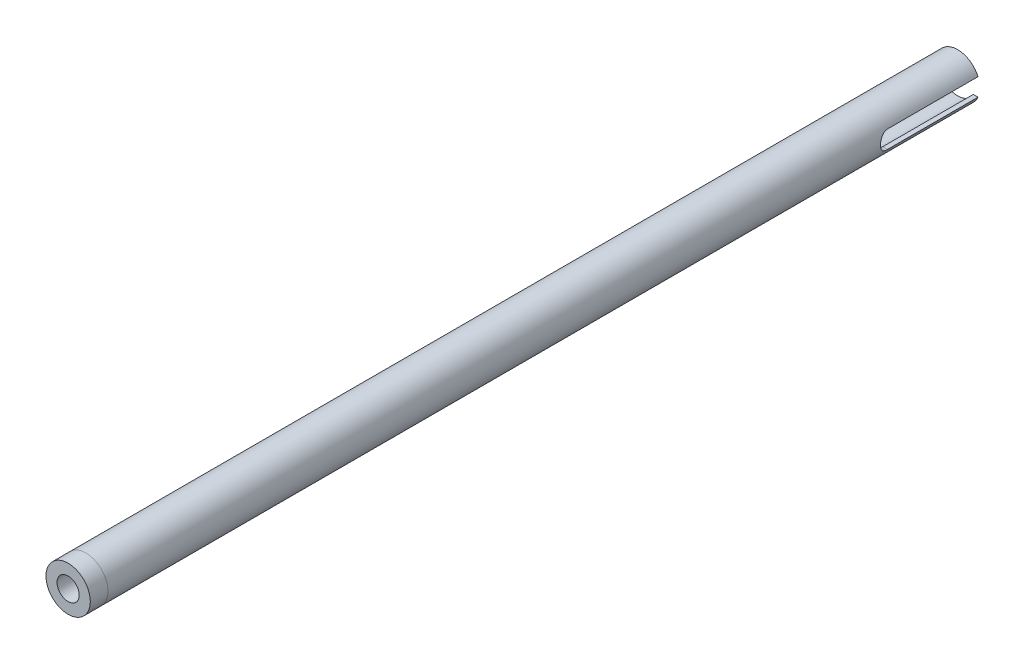
ISO-10303-21;
HEADER;
FILE_DESCRIPTION(('STEP AP214'),'2;1');
FILE_NAME('part.step','',(''),(''),'','','');
FILE_SCHEMA(('AUTOMOTIVE_DESIGN { 1 0 10303 214 1 1 1 1 }'));
ENDSEC;
DATA;
#1=APPLICATION_CONTEXT('core data for automotive mechanical design processes');
#2=APPLICATION_PROTOCOL_DEFINITION('international standard','automotive_design',2000,#1);
#3=PRODUCT_CONTEXT('',#1,'mechanical');
#4=PRODUCT('Part','Part','',(#3));
#5=PRODUCT_RELATED_PRODUCT_CATEGORY('part','',(#4));
#6=PRODUCT_DEFINITION_FORMATION('','',#4);
#7=PRODUCT_DEFINITION_CONTEXT('part definition',#1,'design');
#8=PRODUCT_DEFINITION('design','',#6,#7);
#9=PRODUCT_DEFINITION_SHAPE('','',#8);
#10=(LENGTH_UNIT() NAMED_UNIT(*) SI_UNIT(.MILLI.,.METRE.));
#11=(NAMED_UNIT(*) PLANE_ANGLE_UNIT() SI_UNIT($,.RADIAN.));
#12=(NAMED_UNIT(*) SI_UNIT($,.STERADIAN.) SOLID_ANGLE_UNIT());
#13=UNCERTAINTY_MEASURE_WITH_UNIT(LENGTH_MEASURE(1.E-05),#10,'distance_accuracy_value','');
#14=(GEOMETRIC_REPRESENTATION_CONTEXT(3) GLOBAL_UNCERTAINTY_ASSIGNED_CONTEXT((#13)) GLOBAL_UNIT_ASSIGNED_CONTEXT((#10,
#11,#12)) REPRESENTATION_CONTEXT('',''));
#15=CARTESIAN_POINT('',(0.,0.,0.));
#16=DIRECTION('',(0.,0.,1.));
#17=DIRECTION('',(1.,0.,0.));
#18=AXIS2_PLACEMENT_3D('',#15,#16,#17);
#19=CARTESIAN_POINT('',(0.,0.,-318.482551856964));
#20=DIRECTION('',(0.,0.,1.));
#21=DIRECTION('',(1.,0.,0.));
#22=AXIS2_PLACEMENT_3D('',#19,#20,#21);
#23=CYLINDRICAL_SURFACE('',#22,7.9375);
#24=CARTESIAN_POINT('',(0.,0.,-6.35));
#25=DIRECTION('',(0.,0.,1.));
#26=DIRECTION('',(1.,0.,0.));
#27=AXIS2_PLACEMENT_3D('',#24,#25,#26);
#28=CIRCLE('',#27,7.9375);
#29=CARTESIAN_POINT('',(7.9375,0.,-6.35));
#30=VERTEX_POINT('',#29);
#31=EDGE_CURVE('E165',#30,#30,#28,.T.);
#32=ORIENTED_EDGE('',*,*,#31,.F.);
#33=EDGE_LOOP('',(#32));
#34=FACE_BOUND('',#33,.T.);
#35=CARTESIAN_POINT('',(-7.2748389157424,3.175,-286.097551856964));
#36=CARTESIAN_POINT('',(-7.27482137043434,3.17501267173453,-286.012131741482));
#37=CARTESIAN_POINT('',(-7.27634297592672,3.17155313247793,-285.926721211919));
#38=CARTESIAN_POINT('',(-7.28233338484875,3.15778866907725,-285.756589207591));
#39=CARTESIAN_POINT('',(-7.28680106535325,3.14748635311323,-285.671867482732));
#40=CARTESIAN_POINT('',(-7.2985291631267,3.12019002880163,-285.504053782923));
#41=CARTESIAN_POINT('',(-7.30577831906487,3.10322299732752,-285.420956638164));
#42=CARTESIAN_POINT('',(-7.32282161153744,3.06278779397035,-285.256645536139));
#43=CARTESIAN_POINT('',(-7.33261590324725,3.03931922568674,-285.175431694025));
#44=CARTESIAN_POINT('',(-7.36535331460444,2.95952924342962,-284.935606871443));
#45=CARTESIAN_POINT('',(-7.39167595677839,2.89376893609239,-284.780481942639));
#46=CARTESIAN_POINT('',(-7.45033259991547,2.73920602658923,-284.483394515928));
#47=CARTESIAN_POINT('',(-7.48267254395243,2.65038060922872,-284.34144524071));
#48=CARTESIAN_POINT('',(-7.55175295441387,2.44684429809694,-284.06672447119));
#49=CARTESIAN_POINT('',(-7.58863404630155,2.33103943595687,-283.934797086678));
#50=CARTESIAN_POINT('',(-7.66147718953598,2.07914562663533,-283.691634203046));
#51=CARTESIAN_POINT('',(-7.69743902899202,1.94305205135846,-283.580403438119));
#52=CARTESIAN_POINT('',(-7.76611692840651,1.64778282664419,-283.377482238623));
#53=CARTESIAN_POINT('',(-7.79864638434712,1.48790317306356,-283.286747827219));
#54=CARTESIAN_POINT('',(-7.85502980346525,1.15369615984563,-283.133890273802));
#55=CARTESIAN_POINT('',(-7.87889360585224,0.979385463602722,-283.071734661184));
#56=CARTESIAN_POINT('',(-7.91022225039827,0.670405323433354,-282.991223017529));
#57=CARTESIAN_POINT('',(-7.92038443902171,0.537888188660439,-282.965545094119));
#58=CARTESIAN_POINT('',(-7.93061686811603,0.337231082382107,-282.939790011038));
#59=CARTESIAN_POINT('',(-7.93319257341971,0.269991647180298,-282.933331913757));
#60=CARTESIAN_POINT('',(-7.93663621925193,0.135173873369596,-282.924710896005));
#61=CARTESIAN_POINT('',(-7.93750363389236,0.0675954368175869,-282.922549298187));
#62=CARTESIAN_POINT('',(-7.9375,0.,-282.922551856964));
#63=B_SPLINE_CURVE_WITH_KNOTS('',3,(#35,#36,#37,#38,#39,#40,#41,#42,#43,#44,#45,#46,#47,#48,#49,
#50,#51,#52,#53,#54,#55,#56,#57,#58,#59,#60,#61,#62),.UNSPECIFIED.,.F.,.F.,(4,2,2,2,2,2,2,2,2,2,
2,2,2,4),(0.,0.256160797396612,0.512224013007058,0.767261264672238,1.02231406945471,
1.53142416248594,2.04103978047897,2.57679273649405,3.11266809162683,3.66991136029742,
4.22651992730645,4.63134321412666,4.8339937586662,5.03670667834028),.UNSPECIFIED.);
#64=CARTESIAN_POINT('',(-7.2748389157424,3.175,-286.097551856964));
#65=VERTEX_POINT('',#64);
#66=CARTESIAN_POINT('',(-7.9375,0.,-282.922551856964));
#67=VERTEX_POINT('',#66);
#68=EDGE_CURVE('E192',#65,#67,#63,.T.);
#69=ORIENTED_EDGE('',*,*,#68,.T.);
#70=CARTESIAN_POINT('',(-7.9375,0.,-282.922551856964));
#71=CARTESIAN_POINT('',(-7.93751279435796,-0.08569732438932,-282.922539826795));
#72=CARTESIAN_POINT('',(-7.93611246860092,-0.171386675169294,-282.926021194267));
#73=CARTESIAN_POINT('',(-7.93058107051394,-0.342092796869093,-282.939877289602));
#74=CARTESIAN_POINT('',(-7.92645080745519,-0.427109759557725,-282.950249974585));
#75=CARTESIAN_POINT('',(-7.91557399086504,-0.595570690948326,-282.977747168652));
#76=CARTESIAN_POINT('',(-7.90883664469869,-0.679019123580016,-282.994847919925));
#77=CARTESIAN_POINT('',(-7.89293284658536,-0.844038966454648,-283.035615167399));
#78=CARTESIAN_POINT('',(-7.88376629739099,-0.925610301410305,-283.059281926455));
#79=CARTESIAN_POINT('',(-7.85297007832481,-1.16656173687588,-283.139789582154));
#80=CARTESIAN_POINT('',(-7.82802544143958,-1.32244720282989,-283.206182215031));
#81=CARTESIAN_POINT('',(-7.77174407779742,-1.62081902572888,-283.362227619024));
#82=CARTESIAN_POINT('',(-7.74040257287306,-1.7632952496653,-283.451897791087));
#83=CARTESIAN_POINT('',(-7.67287736621953,-2.03755465224644,-283.656351398603));
#84=CARTESIAN_POINT('',(-7.63654472176442,-2.16862853615059,-283.772038255334));
#85=CARTESIAN_POINT('',(-7.56380976030912,-2.41011022612819,-284.023332357043));
#86=CARTESIAN_POINT('',(-7.52740741976911,-2.52050895891189,-284.158948301525));
#87=CARTESIAN_POINT('',(-7.45683282624284,-2.72240939900242,-284.453646796392));
#88=CARTESIAN_POINT('',(-7.4228346735038,-2.81283701743189,-284.613510786307));
#89=CARTESIAN_POINT('',(-7.3633362219632,-2.96511894168388,-284.947636751104));
#90=CARTESIAN_POINT('',(-7.33782422493328,-3.02701262758154,-285.121878488863));
#91=CARTESIAN_POINT('',(-7.30424985403508,-3.10695047193342,-285.430182213514));
#92=CARTESIAN_POINT('',(-7.29331360019113,-3.13238569878909,-285.5620409744));
#93=CARTESIAN_POINT('',(-7.28227977674291,-3.15790858319001,-285.761757856094));
#94=CARTESIAN_POINT('',(-7.27949685702346,-3.16431127275807,-285.828706146854));
#95=CARTESIAN_POINT('',(-7.27577355567174,-3.17285909036155,-285.96294770472));
#96=CARTESIAN_POINT('',(-7.27483380475762,-3.1750027609968,-286.030241082018));
#97=CARTESIAN_POINT('',(-7.2748389157424,-3.175,-286.097551856964));
#98=B_SPLINE_CURVE_WITH_KNOTS('',3,(#70,#71,#72,#73,#74,#75,#76,#77,#78,#79,#80,#81,#82,#83,#84,
#85,#86,#87,#88,#89,#90,#91,#92,#93,#94,#95,#96,#97),.UNSPECIFIED.,.F.,.F.,(4,2,2,2,2,2,2,2,2,2,
2,2,2,4),(0.,0.256996432008011,0.513916713336987,0.769937797705391,1.02596913282157,
1.53722547809954,2.04886511530059,2.58219314099272,3.11575467201799,3.67332953074261,
4.2301325519037,4.63306130520182,4.8348500382744,5.03670780985613),.UNSPECIFIED.);
#99=CARTESIAN_POINT('',(-7.2748389157424,-3.175,-286.097551856964));
#100=VERTEX_POINT('',#99);
#101=EDGE_CURVE('E144',#67,#100,#98,.T.);
#102=ORIENTED_EDGE('',*,*,#101,.T.);
#103=DIRECTION('',(0.,0.,-1.));
#104=VECTOR('',#103,1.);
#105=CARTESIAN_POINT('',(-7.2748389157424,-3.175,-282.922551856964));
#106=LINE('',#105,#104);
#107=CARTESIAN_POINT('',(-7.2748389157424,-3.175,-318.482551856964));
#108=VERTEX_POINT('',#107);
#109=EDGE_CURVE('E139',#100,#108,#106,.T.);
#110=ORIENTED_EDGE('',*,*,#109,.T.);
#111=CARTESIAN_POINT('',(0.,0.,-318.482551856964));
#112=DIRECTION('',(0.,0.,1.));
#113=DIRECTION('',(1.,0.,0.));
#114=AXIS2_PLACEMENT_3D('',#111,#112,#113);
#115=CIRCLE('',#114,7.9375);
#116=CARTESIAN_POINT('',(7.2748389157424,-3.175,-318.482551856964));
#117=VERTEX_POINT('',#116);
#118=EDGE_CURVE('E142',#108,#117,#115,.T.);
#119=ORIENTED_EDGE('',*,*,#118,.T.);
#120=DIRECTION('',(0.,0.,-1.));
#121=VECTOR('',#120,1.);
#122=CARTESIAN_POINT('',(7.2748389157424,-3.175,-282.922551856964));
#123=LINE('',#122,#121);
#124=CARTESIAN_POINT('',(7.2748389157424,-3.175,-286.097551856964));
#125=VERTEX_POINT('',#124);
#126=EDGE_CURVE('E425',#125,#117,#123,.T.);
#127=ORIENTED_EDGE('',*,*,#126,.F.);
#128=CARTESIAN_POINT('',(7.2748389157424,-3.175,-286.097551856964));
#129=CARTESIAN_POINT('',(7.27482137043434,-3.17501267173453,-286.012131741482));
#130=CARTESIAN_POINT('',(7.27634297592672,-3.17155313247793,-285.926721211919));
#131=CARTESIAN_POINT('',(7.28233338484875,-3.15778866907725,-285.756589207591));
#132=CARTESIAN_POINT('',(7.28680106535325,-3.14748635311323,-285.671867482732));
#133=CARTESIAN_POINT('',(7.2985291631267,-3.12019002880163,-285.504053782923));
#134=CARTESIAN_POINT('',(7.30577831906487,-3.10322299732752,-285.420956638164));
#135=CARTESIAN_POINT('',(7.32282161153744,-3.06278779397035,-285.256645536139));
#136=CARTESIAN_POINT('',(7.33261590324725,-3.03931922568674,-285.175431694025));
#137=CARTESIAN_POINT('',(7.36535331460444,-2.95952924342962,-284.935606871443));
#138=CARTESIAN_POINT('',(7.39167595677839,-2.89376893609239,-284.780481942639));
#139=CARTESIAN_POINT('',(7.45033259991547,-2.73920602658923,-284.483394515928));
#140=CARTESIAN_POINT('',(7.48267254395243,-2.65038060922872,-284.34144524071));
#141=CARTESIAN_POINT('',(7.55175295441387,-2.44684429809694,-284.06672447119));
#142=CARTESIAN_POINT('',(7.58863404630155,-2.33103943595687,-283.934797086678));
#143=CARTESIAN_POINT('',(7.66147718953598,-2.07914562663533,-283.691634203046));
#144=CARTESIAN_POINT('',(7.69743902899202,-1.94305205135846,-283.580403438119));
#145=CARTESIAN_POINT('',(7.76611692840651,-1.64778282664419,-283.377482238623));
#146=CARTESIAN_POINT('',(7.79864638434712,-1.48790317306356,-283.286747827219));
#147=CARTESIAN_POINT('',(7.85502980346525,-1.15369615984563,-283.133890273802));
#148=CARTESIAN_POINT('',(7.87889360585224,-0.979385463602722,-283.071734661184));
#149=CARTESIAN_POINT('',(7.91022225039827,-0.670405323433354,-282.991223017529));
#150=CARTESIAN_POINT('',(7.92038443902171,-0.537888188660439,-282.965545094119));
#151=CARTESIAN_POINT('',(7.93061686811603,-0.337231082382107,-282.939790011038));
#152=CARTESIAN_POINT('',(7.93319257341971,-0.269991647180298,-282.933331913757));
#153=CARTESIAN_POINT('',(7.93663621925193,-0.135173873369596,-282.924710896005));
#154=CARTESIAN_POINT('',(7.93750363389236,-0.0675954368175869,-282.922549298187));
#155=CARTESIAN_POINT('',(7.9375,0.,-282.922551856964));
#156=B_SPLINE_CURVE_WITH_KNOTS('',3,(#128,#129,#130,#131,#132,#133,#134,#135,#136,#137,#138,
#139,#140,#141,#142,#143,#144,#145,#146,#147,#148,#149,#150,#151,#152,#153,#154,#155),
.UNSPECIFIED.,.F.,.F.,(4,2,2,2,2,2,2,2,2,2,2,2,2,4),(0.,0.256160797396612,0.512224013007058,
0.767261264672238,1.02231406945471,1.53142416248594,2.04103978047897,2.57679273649405,
3.11266809162683,3.66991136029742,4.22651992730645,4.63134321412666,4.8339937586662,
5.03670667834028),.UNSPECIFIED.);
#157=CARTESIAN_POINT('',(7.9375,0.,-282.922551856964));
#158=VERTEX_POINT('',#157);
#159=EDGE_CURVE('E85',#125,#158,#156,.T.);
#160=ORIENTED_EDGE('',*,*,#159,.T.);
#161=CARTESIAN_POINT('',(7.9375,0.,-282.922551856964));
#162=CARTESIAN_POINT('',(7.93751279435796,0.08569732438932,-282.922539826795));
#163=CARTESIAN_POINT('',(7.93611246860092,0.171386675169294,-282.926021194267));
#164=CARTESIAN_POINT('',(7.93058107051394,0.342092796869093,-282.939877289602));
#165=CARTESIAN_POINT('',(7.92645080745519,0.427109759557725,-282.950249974585));
#166=CARTESIAN_POINT('',(7.91557399086504,0.595570690948326,-282.977747168652));
#167=CARTESIAN_POINT('',(7.90883664469869,0.679019123580016,-282.994847919925));
#168=CARTESIAN_POINT('',(7.89293284658536,0.844038966454648,-283.035615167399));
#169=CARTESIAN_POINT('',(7.88376629739099,0.925610301410305,-283.059281926455));
#170=CARTESIAN_POINT('',(7.85297007832481,1.16656173687588,-283.139789582154));
#171=CARTESIAN_POINT('',(7.82802544143958,1.32244720282989,-283.206182215031));
#172=CARTESIAN_POINT('',(7.77174407779742,1.62081902572888,-283.362227619024));
#173=CARTESIAN_POINT('',(7.74040257287306,1.7632952496653,-283.451897791087));
#174=CARTESIAN_POINT('',(7.67287736621953,2.03755465224644,-283.656351398603));
#175=CARTESIAN_POINT('',(7.63654472176442,2.16862853615059,-283.772038255334));
#176=CARTESIAN_POINT('',(7.56380976030912,2.41011022612819,-284.023332357043));
#177=CARTESIAN_POINT('',(7.52740741976911,2.52050895891189,-284.158948301525));
#178=CARTESIAN_POINT('',(7.45683282624284,2.72240939900242,-284.453646796392));
#179=CARTESIAN_POINT('',(7.4228346735038,2.81283701743189,-284.613510786307));
#180=CARTESIAN_POINT('',(7.3633362219632,2.96511894168388,-284.947636751104));
#181=CARTESIAN_POINT('',(7.33782422493328,3.02701262758154,-285.121878488863));
#182=CARTESIAN_POINT('',(7.30424985403508,3.10695047193342,-285.430182213514));
#183=CARTESIAN_POINT('',(7.29331360019113,3.13238569878909,-285.5620409744));
#184=CARTESIAN_POINT('',(7.28227977674291,3.15790858319001,-285.761757856094));
#185=CARTESIAN_POINT('',(7.27949685702346,3.16431127275807,-285.828706146854));
#186=CARTESIAN_POINT('',(7.27577355567174,3.17285909036155,-285.96294770472));
#187=CARTESIAN_POINT('',(7.27483380475762,3.1750027609968,-286.030241082018));
#188=CARTESIAN_POINT('',(7.2748389157424,3.175,-286.097551856964));
#189=B_SPLINE_CURVE_WITH_KNOTS('',3,(#161,#162,#163,#164,#165,#166,#167,#168,#169,#170,#171,
#172,#173,#174,#175,#176,#177,#178,#179,#180,#181,#182,#183,#184,#185,#186,#187,#188),
.UNSPECIFIED.,.F.,.F.,(4,2,2,2,2,2,2,2,2,2,2,2,2,4),(0.,0.256996432008011,0.513916713336987,
0.769937797705391,1.02596913282157,1.53722547809954,2.04886511530059,2.58219314099272,
3.11575467201799,3.67332953074261,4.2301325519037,4.63306130520182,4.8348500382744,
5.03670780985613),.UNSPECIFIED.);
#190=CARTESIAN_POINT('',(7.2748389157424,3.175,-286.097551856964));
#191=VERTEX_POINT('',#190);
#192=EDGE_CURVE('E71',#158,#191,#189,.T.);
#193=ORIENTED_EDGE('',*,*,#192,.T.);
#194=DIRECTION('',(0.,0.,-1.));
#195=VECTOR('',#194,1.);
#196=CARTESIAN_POINT('',(7.2748389157424,3.175,-282.922551856964));
#197=LINE('',#196,#195);
#198=CARTESIAN_POINT('',(7.2748389157424,3.175,-318.482551856964));
#199=VERTEX_POINT('',#198);
#200=EDGE_CURVE('E158',#191,#199,#197,.T.);
#201=ORIENTED_EDGE('',*,*,#200,.T.);
#202=CARTESIAN_POINT('',(-7.2748389157424,3.175,-318.482551856964));
#203=VERTEX_POINT('',#202);
#204=EDGE_CURVE('E164',#199,#203,#115,.T.);
#205=ORIENTED_EDGE('',*,*,#204,.T.);
#206=DIRECTION('',(0.,0.,-1.));
#207=VECTOR('',#206,1.);
#208=CARTESIAN_POINT('',(-7.2748389157424,3.175,-282.922551856964));
#209=LINE('',#208,#207);
#210=EDGE_CURVE('E418',#65,#203,#209,.T.);
#211=ORIENTED_EDGE('',*,*,#210,.F.);
#212=EDGE_LOOP('',(#69,#102,#110,#119,#127,#160,#193,#201,#205,#211));
#213=FACE_BOUND('',#212,.T.);
#214=ADVANCED_FACE('F61',(#34,#213),#23,.T.);
#215=CARTESIAN_POINT('',(0.,0.,-318.482551856964));
#216=DIRECTION('',(0.,0.,1.));
#217=DIRECTION('',(1.,0.,0.));
#218=AXIS2_PLACEMENT_3D('',#215,#216,#217);
#219=PLANE('',#218);
#220=DIRECTION('',(1.,0.,0.));
#221=VECTOR('',#220,1.);
#222=CARTESIAN_POINT('',(0.,-3.175,-318.482551856964));
#223=LINE('',#222,#221);
#224=CARTESIAN_POINT('',(-5.57246419907746,-3.175,-318.482551856964));
#225=VERTEX_POINT('',#224);
#226=EDGE_CURVE('E151',#108,#225,#223,.T.);
#227=ORIENTED_EDGE('',*,*,#226,.T.);
#228=CARTESIAN_POINT('',(0.,0.,-318.482551856964));
#229=DIRECTION('',(0.,0.,1.));
#230=DIRECTION('',(1.,0.,0.));
#231=AXIS2_PLACEMENT_3D('',#228,#229,#230);
#232=CIRCLE('',#231,6.4135);
#233=CARTESIAN_POINT('',(5.57246419907746,-3.175,-318.482551856964));
#234=VERTEX_POINT('',#233);
#235=EDGE_CURVE('E273',#225,#234,#232,.T.);
#236=ORIENTED_EDGE('',*,*,#235,.T.);
#237=DIRECTION('',(1.,0.,0.));
#238=VECTOR('',#237,1.);
#239=CARTESIAN_POINT('',(0.,-3.175,-318.482551856964));
#240=LINE('',#239,#238);
#241=EDGE_CURVE('E163',#234,#117,#240,.T.);
#242=ORIENTED_EDGE('',*,*,#241,.T.);
#243=ORIENTED_EDGE('',*,*,#118,.F.);
#244=EDGE_LOOP('',(#227,#236,#242,#243));
#245=FACE_BOUND('',#244,.T.);
#246=ADVANCED_FACE('F161',(#245),#219,.F.);
#247=CARTESIAN_POINT('',(0.,0.,-318.482551856964));
#248=DIRECTION('',(0.,0.,1.));
#249=DIRECTION('',(1.,0.,0.));
#250=AXIS2_PLACEMENT_3D('',#247,#248,#249);
#251=CYLINDRICAL_SURFACE('',#250,6.4135);
#252=CARTESIAN_POINT('',(0.,0.,-6.35));
#253=DIRECTION('',(0.,0.,1.));
#254=DIRECTION('',(1.,0.,0.));
#255=AXIS2_PLACEMENT_3D('',#252,#253,#254);
#256=CIRCLE('',#255,6.4135);
#257=CARTESIAN_POINT('',(6.4135,0.,-6.35));
#258=VERTEX_POINT('',#257);
#259=EDGE_CURVE('E147',#258,#258,#256,.T.);
#260=ORIENTED_EDGE('',*,*,#259,.T.);
#261=EDGE_LOOP('',(#260));
#262=FACE_BOUND('',#261,.T.);
#263=DIRECTION('',(0.,0.,-1.));
#264=VECTOR('',#263,1.);
#265=CARTESIAN_POINT('',(-5.57246419907746,-3.175,-282.922551856964));
#266=LINE('',#265,#264);
#267=CARTESIAN_POINT('',(-5.57246419907746,-3.175,-286.097551856964));
#268=VERTEX_POINT('',#267);
#269=EDGE_CURVE('E148',#268,#225,#266,.T.);
#270=ORIENTED_EDGE('',*,*,#269,.F.);
#271=CARTESIAN_POINT('',(-5.57246419907746,-3.175,-286.097551856964));
#272=CARTESIAN_POINT('',(-5.57244013006406,-3.17501485930532,-286.014272743926));
#273=CARTESIAN_POINT('',(-5.57433046393327,-3.17172393593588,-285.931006977055));
#274=CARTESIAN_POINT('',(-5.58175879139227,-3.15864741746939,-285.765199392243));
#275=CARTESIAN_POINT('',(-5.58729459414879,-3.14886572313217,-285.682657169642));
#276=CARTESIAN_POINT('',(-5.60179156831922,-3.12299843383605,-285.519360362913));
#277=CARTESIAN_POINT('',(-5.61073298145,-3.10694918790095,-285.438598257999));
#278=CARTESIAN_POINT('',(-5.63171276239417,-3.06875665913499,-285.278954342498));
#279=CARTESIAN_POINT('',(-5.64375147558632,-3.04661269666535,-285.200072742678));
#280=CARTESIAN_POINT('',(-5.6838799338154,-2.97148657354666,-284.96733956768));
#281=CARTESIAN_POINT('',(-5.71602843451584,-2.90973243042152,-284.816919070441));
#282=CARTESIAN_POINT('',(-5.78746445334561,-2.76491119647661,-284.528461853613));
#283=CARTESIAN_POINT('',(-5.8267630725243,-2.68181088046089,-284.390444896247));
#284=CARTESIAN_POINT('',(-5.91189137020974,-2.48887418737119,-284.118647812219));
#285=CARTESIAN_POINT('',(-5.95799203211627,-2.37743022169016,-283.986091009767));
#286=CARTESIAN_POINT('',(-6.04933625068999,-2.13433179626949,-283.740623340695));
#287=CARTESIAN_POINT('',(-6.09457954365871,-2.00267122837297,-283.627718433682));
#288=CARTESIAN_POINT('',(-6.18270630442022,-1.71220053093684,-283.41739914123));
#289=CARTESIAN_POINT('',(-6.22523407848511,-1.55216870534977,-283.321509390798));
#290=CARTESIAN_POINT('',(-6.29953728626817,-1.21586879246633,-283.158660494481));
#291=CARTESIAN_POINT('',(-6.33132906884324,-1.03962591706377,-283.091657316438));
#292=CARTESIAN_POINT('',(-6.37455801221378,-0.719418942476251,-283.001785484108));
#293=CARTESIAN_POINT('',(-6.38903678436651,-0.577736145507957,-282.972212769743));
#294=CARTESIAN_POINT('',(-6.40364692368403,-0.362616983152034,-282.942491695429));
#295=CARTESIAN_POINT('',(-6.40733246196224,-0.290370591494075,-282.935024182791));
#296=CARTESIAN_POINT('',(-6.41226237468065,-0.145424356491903,-282.925051293853));
#297=CARTESIAN_POINT('',(-6.41350576158006,-0.0727243416303698,-282.922547924916));
#298=CARTESIAN_POINT('',(-6.4135,0.,-282.922551856964));
#299=B_SPLINE_CURVE_WITH_KNOTS('',3,(#271,#272,#273,#274,#275,#276,#277,#278,#279,#280,#281,
#282,#283,#284,#285,#286,#287,#288,#289,#290,#291,#292,#293,#294,#295,#296,#297,#298),
.UNSPECIFIED.,.F.,.F.,(4,2,2,2,2,2,2,2,2,2,2,2,2,4),(0.,0.249729002226608,0.499308060527582,
0.747460667546715,0.995640957972498,1.49055300136654,1.98624009021394,2.52160227908797,
3.05712653941521,3.62817923327589,4.19835836008502,4.63305000595099,4.85103401853339,
5.06910615989469),.UNSPECIFIED.);
#300=CARTESIAN_POINT('',(-6.4135,0.,-282.922551856964));
#301=VERTEX_POINT('',#300);
#302=EDGE_CURVE('E219',#268,#301,#299,.T.);
#303=ORIENTED_EDGE('',*,*,#302,.T.);
#304=CARTESIAN_POINT('',(-6.4135,0.,-282.922551856964));
#305=CARTESIAN_POINT('',(-6.41351478956105,0.0839162873638195,-282.922538457068));
#306=CARTESIAN_POINT('',(-6.41185341043851,0.167823114288182,-282.925878383115));
#307=CARTESIAN_POINT('',(-6.40528923860734,0.33495253632637,-282.93916082372));
#308=CARTESIAN_POINT('',(-6.40038773102953,0.418175389480093,-282.949100720541));
#309=CARTESIAN_POINT('',(-6.38748331817869,0.58296549878522,-282.975419525059));
#310=CARTESIAN_POINT('',(-6.37949454331383,0.664538541389253,-282.991769100547));
#311=CARTESIAN_POINT('',(-6.36062930478242,0.825821595252368,-283.03070740414));
#312=CARTESIAN_POINT('',(-6.34975266552956,0.905531492908811,-283.053296511621));
#313=CARTESIAN_POINT('',(-6.31319792977548,1.14087800407252,-283.130033074381));
#314=CARTESIAN_POINT('',(-6.28356695572383,1.29306927815055,-283.193204722569));
#315=CARTESIAN_POINT('',(-6.21648032622801,1.58455945770353,-283.341355464549));
#316=CARTESIAN_POINT('',(-6.17901685649499,1.72384528592309,-283.426356356329));
#317=CARTESIAN_POINT('',(-6.09713913910647,1.99475482128856,-283.62145649458));
#318=CARTESIAN_POINT('',(-6.05244508581476,2.12544046453043,-283.732741371318));
#319=CARTESIAN_POINT('',(-5.96206469267669,2.36716277188881,-283.974710817483));
#320=CARTESIAN_POINT('',(-5.9163776032387,2.47818397002904,-284.105410509323));
#321=CARTESIAN_POINT('',(-5.82517699615972,2.68591268931947,-284.394456338275));
#322=CARTESIAN_POINT('',(-5.77994318763785,2.78087960507694,-284.554151532855));
#323=CARTESIAN_POINT('',(-5.69959190124919,2.9420744279085,-284.889534810037));
#324=CARTESIAN_POINT('',(-5.66445328320705,3.00836254036259,-285.065188443209));
#325=CARTESIAN_POINT('',(-5.61637168534323,3.09697219420915,-285.383639817602));
#326=CARTESIAN_POINT('',(-5.60011055849822,3.1260622343607,-285.524054420262));
#327=CARTESIAN_POINT('',(-5.58363385282995,3.15533369889112,-285.737431298505));
#328=CARTESIAN_POINT('',(-5.57946041232981,3.16269716900745,-285.809163023386));
#329=CARTESIAN_POINT('',(-5.57386984218861,3.17253394278506,-285.953104963429));
#330=CARTESIAN_POINT('',(-5.57245416126573,3.17500467618403,-286.0253154101));
#331=CARTESIAN_POINT('',(-5.57246419907746,3.175,-286.097551856964));
#332=B_SPLINE_CURVE_WITH_KNOTS('',3,(#304,#305,#306,#307,#308,#309,#310,#311,#312,#313,#314,
#315,#316,#317,#318,#319,#320,#321,#322,#323,#324,#325,#326,#327,#328,#329,#330,#331),
.UNSPECIFIED.,.F.,.F.,(4,2,2,2,2,2,2,2,2,2,2,2,2,4),(0.,0.251650249697328,0.503200747298848,
0.75361328099314,1.00404104361821,1.50387930503274,2.00421864304453,2.53410176460237,
3.06439980342596,3.63519589642624,4.20478783377489,4.63602373673194,4.85251353275904,
5.06911702550462),.UNSPECIFIED.);
#333=CARTESIAN_POINT('',(-5.57246419907746,3.175,-286.097551856964));
#334=VERTEX_POINT('',#333);
#335=EDGE_CURVE('E184',#301,#334,#332,.T.);
#336=ORIENTED_EDGE('',*,*,#335,.T.);
#337=DIRECTION('',(0.,0.,-1.));
#338=VECTOR('',#337,1.);
#339=CARTESIAN_POINT('',(-5.57246419907746,3.175,-282.922551856964));
#340=LINE('',#339,#338);
#341=CARTESIAN_POINT('',(-5.57246419907746,3.175,-318.482551856964));
#342=VERTEX_POINT('',#341);
#343=EDGE_CURVE('E415',#334,#342,#340,.T.);
#344=ORIENTED_EDGE('',*,*,#343,.T.);
#345=CARTESIAN_POINT('',(5.57246419907746,3.175,-318.482551856964));
#346=VERTEX_POINT('',#345);
#347=EDGE_CURVE('E170',#346,#342,#232,.T.);
#348=ORIENTED_EDGE('',*,*,#347,.F.);
#349=DIRECTION('',(0.,0.,-1.));
#350=VECTOR('',#349,1.);
#351=CARTESIAN_POINT('',(5.57246419907746,3.175,-282.922551856964));
#352=LINE('',#351,#350);
#353=CARTESIAN_POINT('',(5.57246419907746,3.175,-286.097551856964));
#354=VERTEX_POINT('',#353);
#355=EDGE_CURVE('E267',#354,#346,#352,.T.);
#356=ORIENTED_EDGE('',*,*,#355,.F.);
#357=CARTESIAN_POINT('',(5.57246419907746,3.175,-286.097551856964));
#358=CARTESIAN_POINT('',(5.57244013006406,3.17501485930532,-286.014272743926));
#359=CARTESIAN_POINT('',(5.57433046393327,3.17172393593588,-285.931006977055));
#360=CARTESIAN_POINT('',(5.58175879139227,3.15864741746939,-285.765199392243));
#361=CARTESIAN_POINT('',(5.58729459414879,3.14886572313217,-285.682657169642));
#362=CARTESIAN_POINT('',(5.60179156831922,3.12299843383605,-285.519360362913));
#363=CARTESIAN_POINT('',(5.61073298145,3.10694918790095,-285.438598257999));
#364=CARTESIAN_POINT('',(5.63171276239417,3.06875665913499,-285.278954342498));
#365=CARTESIAN_POINT('',(5.64375147558632,3.04661269666535,-285.200072742678));
#366=CARTESIAN_POINT('',(5.6838799338154,2.97148657354666,-284.96733956768));
#367=CARTESIAN_POINT('',(5.71602843451584,2.90973243042152,-284.816919070441));
#368=CARTESIAN_POINT('',(5.78746445334561,2.76491119647661,-284.528461853613));
#369=CARTESIAN_POINT('',(5.8267630725243,2.68181088046089,-284.390444896247));
#370=CARTESIAN_POINT('',(5.91189137020974,2.48887418737119,-284.118647812219));
#371=CARTESIAN_POINT('',(5.95799203211627,2.37743022169016,-283.986091009767));
#372=CARTESIAN_POINT('',(6.04933625068999,2.13433179626949,-283.740623340695));
#373=CARTESIAN_POINT('',(6.09457954365871,2.00267122837297,-283.627718433682));
#374=CARTESIAN_POINT('',(6.18270630442022,1.71220053093684,-283.41739914123));
#375=CARTESIAN_POINT('',(6.22523407848511,1.55216870534977,-283.321509390798));
#376=CARTESIAN_POINT('',(6.29953728626817,1.21586879246633,-283.158660494481));
#377=CARTESIAN_POINT('',(6.33132906884324,1.03962591706377,-283.091657316438));
#378=CARTESIAN_POINT('',(6.37455801221378,0.719418942476251,-283.001785484108));
#379=CARTESIAN_POINT('',(6.38903678436651,0.577736145507957,-282.972212769743));
#380=CARTESIAN_POINT('',(6.40364692368403,0.362616983152034,-282.942491695429));
#381=CARTESIAN_POINT('',(6.40733246196224,0.290370591494075,-282.935024182791));
#382=CARTESIAN_POINT('',(6.41226237468065,0.145424356491903,-282.925051293853));
#383=CARTESIAN_POINT('',(6.41350576158006,0.0727243416303698,-282.922547924916));
#384=CARTESIAN_POINT('',(6.4135,0.,-282.922551856964));
#385=B_SPLINE_CURVE_WITH_KNOTS('',3,(#357,#358,#359,#360,#361,#362,#363,#364,#365,#366,#367,
#368,#369,#370,#371,#372,#373,#374,#375,#376,#377,#378,#379,#380,#381,#382,#383,#384),
.UNSPECIFIED.,.F.,.F.,(4,2,2,2,2,2,2,2,2,2,2,2,2,4),(0.,0.249729002226608,0.499308060527582,
0.747460667546715,0.995640957972498,1.49055300136654,1.98624009021394,2.52160227908797,
3.05712653941521,3.62817923327589,4.19835836008502,4.63305000595099,4.85103401853339,
5.06910615989469),.UNSPECIFIED.);
#386=CARTESIAN_POINT('',(6.4135,0.,-282.922551856964));
#387=VERTEX_POINT('',#386);
#388=EDGE_CURVE('E13',#354,#387,#385,.T.);
#389=ORIENTED_EDGE('',*,*,#388,.T.);
#390=CARTESIAN_POINT('',(6.4135,0.,-282.922551856964));
#391=CARTESIAN_POINT('',(6.41351478956105,-0.0839162873638195,-282.922538457068));
#392=CARTESIAN_POINT('',(6.41185341043851,-0.167823114288182,-282.925878383115));
#393=CARTESIAN_POINT('',(6.40528923860734,-0.33495253632637,-282.93916082372));
#394=CARTESIAN_POINT('',(6.40038773102953,-0.418175389480093,-282.949100720541));
#395=CARTESIAN_POINT('',(6.38748331817869,-0.58296549878522,-282.975419525059));
#396=CARTESIAN_POINT('',(6.37949454331383,-0.664538541389253,-282.991769100547));
#397=CARTESIAN_POINT('',(6.36062930478242,-0.825821595252368,-283.03070740414));
#398=CARTESIAN_POINT('',(6.34975266552956,-0.905531492908811,-283.053296511621));
#399=CARTESIAN_POINT('',(6.31319792977548,-1.14087800407252,-283.130033074381));
#400=CARTESIAN_POINT('',(6.28356695572383,-1.29306927815055,-283.193204722569));
#401=CARTESIAN_POINT('',(6.21648032622801,-1.58455945770353,-283.341355464549));
#402=CARTESIAN_POINT('',(6.17901685649499,-1.72384528592309,-283.426356356329));
#403=CARTESIAN_POINT('',(6.09713913910647,-1.99475482128856,-283.62145649458));
#404=CARTESIAN_POINT('',(6.05244508581476,-2.12544046453043,-283.732741371318));
#405=CARTESIAN_POINT('',(5.96206469267669,-2.36716277188881,-283.974710817483));
#406=CARTESIAN_POINT('',(5.9163776032387,-2.47818397002904,-284.105410509323));
#407=CARTESIAN_POINT('',(5.82517699615972,-2.68591268931947,-284.394456338275));
#408=CARTESIAN_POINT('',(5.77994318763785,-2.78087960507694,-284.554151532855));
#409=CARTESIAN_POINT('',(5.69959190124919,-2.9420744279085,-284.889534810037));
#410=CARTESIAN_POINT('',(5.66445328320705,-3.00836254036259,-285.065188443209));
#411=CARTESIAN_POINT('',(5.61637168534323,-3.09697219420915,-285.383639817602));
#412=CARTESIAN_POINT('',(5.60011055849822,-3.1260622343607,-285.524054420262));
#413=CARTESIAN_POINT('',(5.58363385282995,-3.15533369889112,-285.737431298505));
#414=CARTESIAN_POINT('',(5.57946041232981,-3.16269716900745,-285.809163023386));
#415=CARTESIAN_POINT('',(5.57386984218861,-3.17253394278506,-285.953104963429));
#416=CARTESIAN_POINT('',(5.57245416126573,-3.17500467618403,-286.0253154101));
#417=CARTESIAN_POINT('',(5.57246419907746,-3.175,-286.097551856964));
#418=B_SPLINE_CURVE_WITH_KNOTS('',3,(#390,#391,#392,#393,#394,#395,#396,#397,#398,#399,#400,
#401,#402,#403,#404,#405,#406,#407,#408,#409,#410,#411,#412,#413,#414,#415,#416,#417),
.UNSPECIFIED.,.F.,.F.,(4,2,2,2,2,2,2,2,2,2,2,2,2,4),(0.,0.251650249697328,0.503200747298848,
0.75361328099314,1.00404104361821,1.50387930503274,2.00421864304453,2.53410176460237,
3.06439980342596,3.63519589642624,4.20478783377489,4.63602373673194,4.85251353275904,
5.06911702550462),.UNSPECIFIED.);
#419=CARTESIAN_POINT('',(5.57246419907746,-3.175,-286.097551856964));
#420=VERTEX_POINT('',#419);
#421=EDGE_CURVE('E235',#387,#420,#418,.T.);
#422=ORIENTED_EDGE('',*,*,#421,.T.);
#423=DIRECTION('',(0.,0.,-1.));
#424=VECTOR('',#423,1.);
#425=CARTESIAN_POINT('',(5.57246419907746,-3.175,-282.922551856964));
#426=LINE('',#425,#424);
#427=EDGE_CURVE('E269',#420,#234,#426,.T.);
#428=ORIENTED_EDGE('',*,*,#427,.T.);
#429=ORIENTED_EDGE('',*,*,#235,.F.);
#430=EDGE_LOOP('',(#270,#303,#336,#344,#348,#356,#389,#422,#428,#429));
#431=FACE_BOUND('',#430,.T.);
#432=ADVANCED_FACE('F199',(#262,#431),#251,.F.);
#433=ORIENTED_EDGE('',*,*,#347,.T.);
#434=DIRECTION('',(1.,0.,0.));
#435=VECTOR('',#434,1.);
#436=CARTESIAN_POINT('',(0.,3.175,-318.482551856964));
#437=LINE('',#436,#435);
#438=EDGE_CURVE('E157',#203,#342,#437,.T.);
#439=ORIENTED_EDGE('',*,*,#438,.F.);
#440=ORIENTED_EDGE('',*,*,#204,.F.);
#441=DIRECTION('',(1.,0.,0.));
#442=VECTOR('',#441,1.);
#443=CARTESIAN_POINT('',(0.,3.175,-318.482551856964));
#444=LINE('',#443,#442);
#445=EDGE_CURVE('E251',#346,#199,#444,.T.);
#446=ORIENTED_EDGE('',*,*,#445,.F.);
#447=EDGE_LOOP('',(#433,#439,#440,#446));
#448=FACE_BOUND('',#447,.T.);
#449=ADVANCED_FACE('F284',(#448),#219,.F.);
#450=CARTESIAN_POINT('',(0.,0.,-6.35));
#451=DIRECTION('',(0.,0.,1.));
#452=DIRECTION('',(1.,0.,0.));
#453=AXIS2_PLACEMENT_3D('',#450,#451,#452);
#454=PLANE('',#453);
#455=ORIENTED_EDGE('',*,*,#259,.F.);
#456=EDGE_LOOP('',(#455));
#457=FACE_BOUND('',#456,.T.);
#458=ORIENTED_EDGE('',*,*,#31,.T.);
#459=EDGE_LOOP('',(#458));
#460=FACE_BOUND('',#459,.T.);
#461=ADVANCED_FACE('F281',(#457,#460),#454,.T.);
#462=CARTESIAN_POINT('',(0.,3.175,-282.922551856964));
#463=DIRECTION('',(0.,1.,0.));
#464=DIRECTION('',(0.,0.,1.));
#465=AXIS2_PLACEMENT_3D('',#462,#463,#464);
#466=PLANE('',#465);
#467=ORIENTED_EDGE('',*,*,#200,.F.);
#468=DIRECTION('',(1.,0.,0.));
#469=VECTOR('',#468,1.);
#470=CARTESIAN_POINT('',(5.57246419907746,3.175,-286.097551856964));
#471=LINE('',#470,#469);
#472=EDGE_CURVE('E182',#191,#354,#471,.F.);
#473=ORIENTED_EDGE('',*,*,#472,.T.);
#474=ORIENTED_EDGE('',*,*,#355,.T.);
#475=ORIENTED_EDGE('',*,*,#445,.T.);
#476=EDGE_LOOP('',(#467,#473,#474,#475));
#477=FACE_BOUND('',#476,.T.);
#478=ADVANCED_FACE('F264',(#477),#466,.F.);
#479=CARTESIAN_POINT('',(0.,-3.175,-282.922551856964));
#480=DIRECTION('',(0.,1.,0.));
#481=DIRECTION('',(0.,0.,1.));
#482=AXIS2_PLACEMENT_3D('',#479,#480,#481);
#483=PLANE('',#482);
#484=ORIENTED_EDGE('',*,*,#427,.F.);
#485=DIRECTION('',(1.,0.,0.));
#486=VECTOR('',#485,1.);
#487=CARTESIAN_POINT('',(0.,-3.175,-286.097551856964));
#488=LINE('',#487,#486);
#489=EDGE_CURVE('E179',#420,#125,#488,.T.);
#490=ORIENTED_EDGE('',*,*,#489,.T.);
#491=ORIENTED_EDGE('',*,*,#126,.T.);
#492=ORIENTED_EDGE('',*,*,#241,.F.);
#493=EDGE_LOOP('',(#484,#490,#491,#492));
#494=FACE_BOUND('',#493,.T.);
#495=ADVANCED_FACE('F359',(#494),#483,.T.);
#496=CARTESIAN_POINT('',(0.,-3.175,-282.922551856964));
#497=DIRECTION('',(0.,1.,0.));
#498=DIRECTION('',(0.,0.,1.));
#499=AXIS2_PLACEMENT_3D('',#496,#497,#498);
#500=PLANE('',#499);
#501=ORIENTED_EDGE('',*,*,#109,.F.);
#502=DIRECTION('',(1.,0.,0.));
#503=VECTOR('',#502,1.);
#504=CARTESIAN_POINT('',(0.,-3.175,-286.097551856964));
#505=LINE('',#504,#503);
#506=EDGE_CURVE('E177',#100,#268,#505,.T.);
#507=ORIENTED_EDGE('',*,*,#506,.T.);
#508=ORIENTED_EDGE('',*,*,#269,.T.);
#509=ORIENTED_EDGE('',*,*,#226,.F.);
#510=EDGE_LOOP('',(#501,#507,#508,#509));
#511=FACE_BOUND('',#510,.T.);
#512=ADVANCED_FACE('F152',(#511),#500,.T.);
#513=CARTESIAN_POINT('',(0.,3.175,-282.922551856964));
#514=DIRECTION('',(0.,1.,0.));
#515=DIRECTION('',(0.,0.,1.));
#516=AXIS2_PLACEMENT_3D('',#513,#514,#515);
#517=PLANE('',#516);
#518=ORIENTED_EDGE('',*,*,#343,.F.);
#519=DIRECTION('',(1.,0.,0.));
#520=VECTOR('',#519,1.);
#521=CARTESIAN_POINT('',(-7.2748389157424,3.175,-286.097551856964));
#522=LINE('',#521,#520);
#523=EDGE_CURVE('E168',#334,#65,#522,.F.);
#524=ORIENTED_EDGE('',*,*,#523,.T.);
#525=ORIENTED_EDGE('',*,*,#210,.T.);
#526=ORIENTED_EDGE('',*,*,#438,.T.);
#527=EDGE_LOOP('',(#518,#524,#525,#526));
#528=FACE_BOUND('',#527,.T.);
#529=ADVANCED_FACE('F214',(#528),#517,.F.);
#530=CARTESIAN_POINT('',(0.,0.,-286.097551856964));
#531=DIRECTION('',(1.,0.,0.));
#532=DIRECTION('',(0.,0.,-1.));
#533=AXIS2_PLACEMENT_3D('',#530,#531,#532);
#534=CYLINDRICAL_SURFACE('',#533,3.175);
#535=ORIENTED_EDGE('',*,*,#506,.F.);
#536=ORIENTED_EDGE('',*,*,#101,.F.);
#537=DIRECTION('',(1.,0.,0.));
#538=VECTOR('',#537,1.);
#539=CARTESIAN_POINT('',(0.,0.,-282.922551856964));
#540=LINE('',#539,#538);
#541=EDGE_CURVE('E249',#301,#67,#540,.F.);
#542=ORIENTED_EDGE('',*,*,#541,.F.);
#543=ORIENTED_EDGE('',*,*,#302,.F.);
#544=EDGE_LOOP('',(#535,#536,#542,#543));
#545=FACE_BOUND('',#544,.T.);
#546=ADVANCED_FACE('F207',(#545),#534,.F.);
#547=CARTESIAN_POINT('',(0.,0.,-286.097551856964));
#548=DIRECTION('',(-1.,0.,0.));
#549=DIRECTION('',(0.,0.,1.));
#550=AXIS2_PLACEMENT_3D('',#547,#548,#549);
#551=CYLINDRICAL_SURFACE('',#550,3.175);
#552=ORIENTED_EDGE('',*,*,#68,.F.);
#553=ORIENTED_EDGE('',*,*,#523,.F.);
#554=ORIENTED_EDGE('',*,*,#335,.F.);
#555=ORIENTED_EDGE('',*,*,#541,.T.);
#556=EDGE_LOOP('',(#552,#553,#554,#555));
#557=FACE_BOUND('',#556,.T.);
#558=ADVANCED_FACE('F203',(#557),#551,.F.);
#559=CARTESIAN_POINT('',(0.,0.,-286.097551856964));
#560=DIRECTION('',(-1.,0.,0.));
#561=DIRECTION('',(0.,0.,1.));
#562=AXIS2_PLACEMENT_3D('',#559,#560,#561);
#563=CYLINDRICAL_SURFACE('',#562,3.175);
#564=DIRECTION('',(1.,0.,0.));
#565=VECTOR('',#564,1.);
#566=CARTESIAN_POINT('',(7.2748389157424,0.,-282.922551856964));
#567=LINE('',#566,#565);
#568=EDGE_CURVE('E66',#387,#158,#567,.T.);
#569=ORIENTED_EDGE('',*,*,#568,.F.);
#570=ORIENTED_EDGE('',*,*,#388,.F.);
#571=ORIENTED_EDGE('',*,*,#472,.F.);
#572=ORIENTED_EDGE('',*,*,#192,.F.);
#573=EDGE_LOOP('',(#569,#570,#571,#572));
#574=FACE_BOUND('',#573,.T.);
#575=ADVANCED_FACE('F63',(#574),#563,.F.);
#576=CARTESIAN_POINT('',(0.,0.,-286.097551856964));
#577=DIRECTION('',(1.,0.,0.));
#578=DIRECTION('',(0.,0.,-1.));
#579=AXIS2_PLACEMENT_3D('',#576,#577,#578);
#580=CYLINDRICAL_SURFACE('',#579,3.175);
#581=ORIENTED_EDGE('',*,*,#421,.F.);
#582=ORIENTED_EDGE('',*,*,#568,.T.);
#583=ORIENTED_EDGE('',*,*,#159,.F.);
#584=ORIENTED_EDGE('',*,*,#489,.F.);
#585=EDGE_LOOP('',(#581,#582,#583,#584));
#586=FACE_BOUND('',#585,.T.);
#587=ADVANCED_FACE('F216',(#586),#580,.F.);
#588=CLOSED_SHELL('',(#214,#246,#432,#449,#461,#478,#495,#512,#529,#546,#558,#575,#587));
#589=MANIFOLD_SOLID_BREP('B2',#588);
#590=CARTESIAN_POINT('',(0.,0.,-6.35));
#591=DIRECTION('',(0.,0.,1.));
#592=DIRECTION('',(1.,0.,0.));
#593=AXIS2_PLACEMENT_3D('',#590,#591,#592);
#594=CYLINDRICAL_SURFACE('',#593,7.9375);
#595=CARTESIAN_POINT('',(0.,0.,-6.35));
#596=DIRECTION('',(0.,0.,1.));
#597=DIRECTION('',(1.,0.,0.));
#598=AXIS2_PLACEMENT_3D('',#595,#596,#597);
#599=CIRCLE('',#598,7.9375);
#600=CARTESIAN_POINT('',(7.9375,0.,-6.35));
#601=VERTEX_POINT('',#600);
#602=EDGE_CURVE('E60',#601,#601,#599,.T.);
#603=ORIENTED_EDGE('',*,*,#602,.T.);
#604=EDGE_LOOP('',(#603));
#605=FACE_BOUND('',#604,.T.);
#606=CARTESIAN_POINT('',(0.,0.,0.));
#607=DIRECTION('',(0.,0.,1.));
#608=DIRECTION('',(1.,0.,0.));
#609=AXIS2_PLACEMENT_3D('',#606,#607,#608);
#610=CIRCLE('',#609,7.9375);
#611=CARTESIAN_POINT('',(7.9375,0.,0.));
#612=VERTEX_POINT('',#611);
#613=EDGE_CURVE('E463',#612,#612,#610,.T.);
#614=ORIENTED_EDGE('',*,*,#613,.F.);
#615=EDGE_LOOP('',(#614));
#616=FACE_BOUND('',#615,.T.);
#617=ADVANCED_FACE('F452',(#605,#616),#594,.T.);
#618=CARTESIAN_POINT('',(0.,0.,-6.35));
#619=DIRECTION('',(0.,0.,1.));
#620=DIRECTION('',(1.,0.,0.));
#621=AXIS2_PLACEMENT_3D('',#618,#619,#620);
#622=CYLINDRICAL_SURFACE('',#621,3.96875);
#623=CARTESIAN_POINT('',(0.,0.,0.));
#624=DIRECTION('',(0.,0.,1.));
#625=DIRECTION('',(1.,0.,0.));
#626=AXIS2_PLACEMENT_3D('',#623,#624,#625);
#627=CIRCLE('',#626,3.96875);
#628=CARTESIAN_POINT('',(3.96875,0.,0.));
#629=VERTEX_POINT('',#628);
#630=EDGE_CURVE('E455',#629,#629,#627,.T.);
#631=ORIENTED_EDGE('',*,*,#630,.T.);
#632=EDGE_LOOP('',(#631));
#633=FACE_BOUND('',#632,.T.);
#634=CARTESIAN_POINT('',(0.,0.,-15.875));
#635=DIRECTION('',(0.,0.,1.));
#636=DIRECTION('',(1.,0.,0.));
#637=AXIS2_PLACEMENT_3D('',#634,#635,#636);
#638=CIRCLE('',#637,3.96875);
#639=CARTESIAN_POINT('',(3.96875,0.,-15.875));
#640=VERTEX_POINT('',#639);
#641=EDGE_CURVE('E475',#640,#640,#638,.T.);
#642=ORIENTED_EDGE('',*,*,#641,.F.);
#643=EDGE_LOOP('',(#642));
#644=FACE_BOUND('',#643,.T.);
#645=ADVANCED_FACE('F483',(#633,#644),#622,.F.);
#646=CARTESIAN_POINT('',(0.,0.,-6.35));
#647=DIRECTION('',(0.,0.,1.));
#648=DIRECTION('',(1.,0.,0.));
#649=AXIS2_PLACEMENT_3D('',#646,#647,#648);
#650=PLANE('',#649);
#651=CARTESIAN_POINT('',(0.,0.,-6.35));
#652=DIRECTION('',(0.,0.,1.));
#653=DIRECTION('',(1.,0.,0.));
#654=AXIS2_PLACEMENT_3D('',#651,#652,#653);
#655=CIRCLE('',#654,6.4135);
#656=CARTESIAN_POINT('',(6.4135,0.,-6.35));
#657=VERTEX_POINT('',#656);
#658=EDGE_CURVE('E465',#657,#657,#655,.T.);
#659=ORIENTED_EDGE('',*,*,#658,.T.);
#660=EDGE_LOOP('',(#659));
#661=FACE_BOUND('',#660,.T.);
#662=ORIENTED_EDGE('',*,*,#602,.F.);
#663=EDGE_LOOP('',(#662));
#664=FACE_BOUND('',#663,.T.);
#665=ADVANCED_FACE('F485',(#661,#664),#650,.F.);
#666=CARTESIAN_POINT('',(0.,0.,0.));
#667=DIRECTION('',(0.,0.,1.));
#668=DIRECTION('',(1.,0.,0.));
#669=AXIS2_PLACEMENT_3D('',#666,#667,#668);
#670=PLANE('',#669);
#671=ORIENTED_EDGE('',*,*,#613,.T.);
#672=EDGE_LOOP('',(#671));
#673=FACE_BOUND('',#672,.T.);
#674=ORIENTED_EDGE('',*,*,#630,.F.);
#675=EDGE_LOOP('',(#674));
#676=FACE_BOUND('',#675,.T.);
#677=ADVANCED_FACE('F491',(#673,#676),#670,.T.);
#678=CARTESIAN_POINT('',(0.,0.,-15.875));
#679=DIRECTION('',(0.,0.,1.));
#680=DIRECTION('',(1.,0.,0.));
#681=AXIS2_PLACEMENT_3D('',#678,#679,#680);
#682=CYLINDRICAL_SURFACE('',#681,6.4135);
#683=CARTESIAN_POINT('',(0.,0.,-15.875));
#684=DIRECTION('',(0.,0.,1.));
#685=DIRECTION('',(1.,0.,0.));
#686=AXIS2_PLACEMENT_3D('',#683,#684,#685);
#687=CIRCLE('',#686,6.4135);
#688=CARTESIAN_POINT('',(6.4135,0.,-15.875));
#689=VERTEX_POINT('',#688);
#690=EDGE_CURVE('E468',#689,#689,#687,.T.);
#691=CARTESIAN_POINT('',(6.4135,0.,-15.875));
#692=CARTESIAN_POINT('',(6.4135,0.,-15.77578125));
#693=CARTESIAN_POINT('',(6.4135,0.,-15.6765625));
#694=CARTESIAN_POINT('',(6.4135,0.,-15.478125));
#695=CARTESIAN_POINT('',(6.4135,0.,-15.37890625));
#696=CARTESIAN_POINT('',(6.4135,0.,-15.18046875));
#697=CARTESIAN_POINT('',(6.4135,0.,-15.08125));
#698=CARTESIAN_POINT('',(6.4135,0.,-14.8828125));
#699=CARTESIAN_POINT('',(6.4135,0.,-14.78359375));
#700=CARTESIAN_POINT('',(6.4135,0.,-14.58515625));
#701=CARTESIAN_POINT('',(6.4135,0.,-14.4859375));
#702=CARTESIAN_POINT('',(6.4135,0.,-14.2875));
#703=CARTESIAN_POINT('',(6.4135,0.,-14.18828125));
#704=CARTESIAN_POINT('',(6.4135,0.,-13.98984375));
#705=CARTESIAN_POINT('',(6.4135,0.,-13.890625));
#706=CARTESIAN_POINT('',(6.4135,0.,-13.6921875));
#707=CARTESIAN_POINT('',(6.4135,0.,-13.59296875));
#708=CARTESIAN_POINT('',(6.4135,0.,-13.39453125));
#709=CARTESIAN_POINT('',(6.4135,0.,-13.2953125));
#710=CARTESIAN_POINT('',(6.4135,0.,-13.096875));
#711=CARTESIAN_POINT('',(6.4135,0.,-12.99765625));
#712=CARTESIAN_POINT('',(6.4135,0.,-12.79921875));
#713=CARTESIAN_POINT('',(6.4135,0.,-12.7));
#714=CARTESIAN_POINT('',(6.4135,0.,-12.5015625));
#715=CARTESIAN_POINT('',(6.4135,0.,-12.40234375));
#716=CARTESIAN_POINT('',(6.4135,0.,-12.20390625));
#717=CARTESIAN_POINT('',(6.4135,0.,-12.1046875));
#718=CARTESIAN_POINT('',(6.4135,0.,-11.90625));
#719=CARTESIAN_POINT('',(6.4135,0.,-11.80703125));
#720=CARTESIAN_POINT('',(6.4135,0.,-11.60859375));
#721=CARTESIAN_POINT('',(6.4135,0.,-11.509375));
#722=CARTESIAN_POINT('',(6.4135,0.,-11.3109375));
#723=CARTESIAN_POINT('',(6.4135,0.,-11.21171875));
#724=CARTESIAN_POINT('',(6.4135,0.,-11.01328125));
#725=CARTESIAN_POINT('',(6.4135,0.,-10.9140625));
#726=CARTESIAN_POINT('',(6.4135,0.,-10.715625));
#727=CARTESIAN_POINT('',(6.4135,0.,-10.61640625));
#728=CARTESIAN_POINT('',(6.4135,0.,-10.41796875));
#729=CARTESIAN_POINT('',(6.4135,0.,-10.31875));
#730=CARTESIAN_POINT('',(6.4135,0.,-10.1203125));
#731=CARTESIAN_POINT('',(6.4135,0.,-10.02109375));
#732=CARTESIAN_POINT('',(6.4135,0.,-9.82265625));
#733=CARTESIAN_POINT('',(6.4135,0.,-9.7234375));
#734=CARTESIAN_POINT('',(6.4135,0.,-9.525));
#735=CARTESIAN_POINT('',(6.4135,0.,-9.42578125));
#736=CARTESIAN_POINT('',(6.4135,0.,-9.22734375));
#737=CARTESIAN_POINT('',(6.4135,0.,-9.128125));
#738=CARTESIAN_POINT('',(6.4135,0.,-8.9296875));
#739=CARTESIAN_POINT('',(6.4135,0.,-8.83046875));
#740=CARTESIAN_POINT('',(6.4135,0.,-8.63203125));
#741=CARTESIAN_POINT('',(6.4135,0.,-8.5328125));
#742=CARTESIAN_POINT('',(6.4135,0.,-8.334375));
#743=CARTESIAN_POINT('',(6.4135,0.,-8.23515625));
#744=CARTESIAN_POINT('',(6.4135,0.,-8.03671875));
#745=CARTESIAN_POINT('',(6.4135,0.,-7.9375));
#746=CARTESIAN_POINT('',(6.4135,0.,-7.7390625));
#747=CARTESIAN_POINT('',(6.4135,0.,-7.63984375));
#748=CARTESIAN_POINT('',(6.4135,0.,-7.44140625));
#749=CARTESIAN_POINT('',(6.4135,0.,-7.3421875));
#750=CARTESIAN_POINT('',(6.4135,0.,-7.14375));
#751=CARTESIAN_POINT('',(6.4135,0.,-7.04453125));
#752=CARTESIAN_POINT('',(6.4135,0.,-6.84609375));
#753=CARTESIAN_POINT('',(6.4135,0.,-6.746875));
#754=CARTESIAN_POINT('',(6.4135,0.,-6.5484375));
#755=CARTESIAN_POINT('',(6.4135,0.,-6.44921875));
#756=CARTESIAN_POINT('',(6.4135,0.,-6.35));
#757=B_SPLINE_CURVE_WITH_KNOTS('',3,(#691,#692,#693,#694,#695,#696,#697,#698,#699,#700,#701,
#702,#703,#704,#705,#706,#707,#708,#709,#710,#711,#712,#713,#714,#715,#716,#717,#718,#719,#720,
#721,#722,#723,#724,#725,#726,#727,#728,#729,#730,#731,#732,#733,#734,#735,#736,#737,#738,#739,
#740,#741,#742,#743,#744,#745,#746,#747,#748,#749,#750,#751,#752,#753,#754,#755,#756),
.UNSPECIFIED.,.F.,.F.,(4,2,2,2,2,2,2,2,2,2,2,2,2,2,2,2,2,2,2,2,2,2,2,2,2,2,2,2,2,2,2,2,4),(0.,
0.297656250000002,0.595312500000002,0.892968750000002,1.190625,1.48828125,1.7859375,2.08359375,
2.38125,2.67890625,2.9765625,3.27421875,3.571875,3.86953125,4.1671875,4.46484375,4.7625,
5.06015625,5.3578125,5.65546875,5.953125,6.25078125,6.5484375,6.84609375,7.14375,7.44140625,
7.7390625,8.03671875,8.334375,8.63203125,8.9296875,9.22734375,9.525),.UNSPECIFIED.);
#758=EDGE_CURVE('BSEAM496',#689,#657,#757,.T.);
#759=ORIENTED_EDGE('',*,*,#690,.T.);
#760=ORIENTED_EDGE('',*,*,#658,.F.);
#761=ORIENTED_EDGE('',*,*,#758,.T.);
#762=ORIENTED_EDGE('',*,*,#758,.F.);
#763=EDGE_LOOP('',(#759,#761,#760,#762));
#764=FACE_BOUND('',#763,.T.);
#765=ADVANCED_FACE('F496',(#764),#682,.T.);
#766=CARTESIAN_POINT('',(0.,0.,-15.875));
#767=DIRECTION('',(0.,0.,1.));
#768=DIRECTION('',(1.,0.,0.));
#769=AXIS2_PLACEMENT_3D('',#766,#767,#768);
#770=PLANE('',#769);
#771=ORIENTED_EDGE('',*,*,#641,.T.);
#772=EDGE_LOOP('',(#771));
#773=FACE_BOUND('',#772,.T.);
#774=ORIENTED_EDGE('',*,*,#690,.F.);
#775=EDGE_LOOP('',(#774));
#776=FACE_BOUND('',#775,.T.);
#777=ADVANCED_FACE('F480',(#773,#776),#770,.F.);
#778=CLOSED_SHELL('',(#617,#645,#665,#677,#765,#777));
#779=MANIFOLD_SOLID_BREP('B7',#778);
#780=ADVANCED_BREP_SHAPE_REPRESENTATION('',(#18,#589,#779),#14);
#781=SHAPE_DEFINITION_REPRESENTATION(#9,#780);
ENDSEC;
END-ISO-10303-21;
